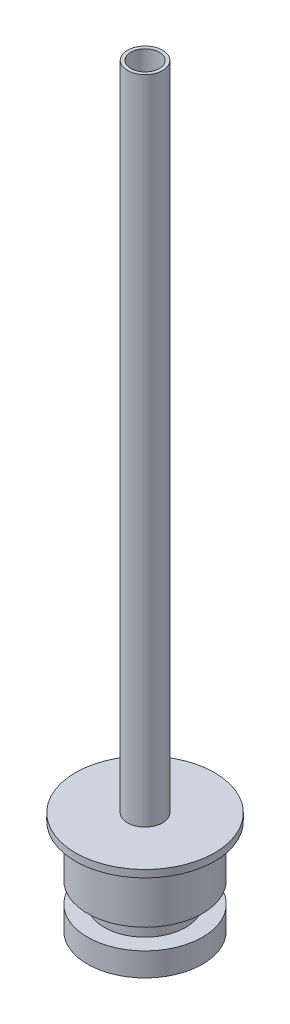
ISO-10303-21;
HEADER;
FILE_DESCRIPTION(('STEP AP214'),'2;1');
FILE_NAME('part.step','',(''),(''),'','','');
FILE_SCHEMA(('AUTOMOTIVE_DESIGN { 1 0 10303 214 1 1 1 1 }'));
ENDSEC;
DATA;
#1=APPLICATION_CONTEXT('core data for automotive mechanical design processes');
#2=APPLICATION_PROTOCOL_DEFINITION('international standard','automotive_design',2000,#1);
#3=PRODUCT_CONTEXT('',#1,'mechanical');
#4=PRODUCT('Part','Part','',(#3));
#5=PRODUCT_RELATED_PRODUCT_CATEGORY('part','',(#4));
#6=PRODUCT_DEFINITION_FORMATION('','',#4);
#7=PRODUCT_DEFINITION_CONTEXT('part definition',#1,'design');
#8=PRODUCT_DEFINITION('design','',#6,#7);
#9=PRODUCT_DEFINITION_SHAPE('','',#8);
#10=(LENGTH_UNIT() NAMED_UNIT(*) SI_UNIT(.MILLI.,.METRE.));
#11=(NAMED_UNIT(*) PLANE_ANGLE_UNIT() SI_UNIT($,.RADIAN.));
#12=(NAMED_UNIT(*) SI_UNIT($,.STERADIAN.) SOLID_ANGLE_UNIT());
#13=UNCERTAINTY_MEASURE_WITH_UNIT(LENGTH_MEASURE(1.E-05),#10,'distance_accuracy_value','');
#14=(GEOMETRIC_REPRESENTATION_CONTEXT(3) GLOBAL_UNCERTAINTY_ASSIGNED_CONTEXT((#13)) GLOBAL_UNIT_ASSIGNED_CONTEXT((#10,
#11,#12)) REPRESENTATION_CONTEXT('',''));
#15=CARTESIAN_POINT('',(0.,0.,0.));
#16=DIRECTION('',(0.,0.,1.));
#17=DIRECTION('',(1.,0.,0.));
#18=AXIS2_PLACEMENT_3D('',#15,#16,#17);
#19=CARTESIAN_POINT('',(0.,13.,0.));
#20=DIRECTION('',(0.,-1.,0.));
#21=DIRECTION('',(0.,0.,-1.));
#22=AXIS2_PLACEMENT_3D('',#19,#20,#21);
#23=CYLINDRICAL_SURFACE('',#22,7.85);
#24=CARTESIAN_POINT('',(0.,13.,0.));
#25=DIRECTION('',(0.,-1.,0.));
#26=DIRECTION('',(0.,0.,-1.));
#27=AXIS2_PLACEMENT_3D('',#24,#25,#26);
#28=CIRCLE('',#27,7.85);
#29=CARTESIAN_POINT('',(0.,13.,-7.85));
#30=VERTEX_POINT('',#29);
#31=EDGE_CURVE('E61',#30,#30,#28,.T.);
#32=CARTESIAN_POINT('',(0.,6.,0.));
#33=DIRECTION('',(0.,-1.,0.));
#34=DIRECTION('',(0.,0.,-1.));
#35=AXIS2_PLACEMENT_3D('',#32,#33,#34);
#36=CIRCLE('',#35,7.85);
#37=CARTESIAN_POINT('',(0.,6.,-7.85));
#38=VERTEX_POINT('',#37);
#39=EDGE_CURVE('E65',#38,#38,#36,.T.);
#40=CARTESIAN_POINT('',(0.,13.,-7.85));
#41=CARTESIAN_POINT('',(0.,12.9270833333333,-7.85));
#42=CARTESIAN_POINT('',(0.,12.8541666666667,-7.85));
#43=CARTESIAN_POINT('',(0.,12.7083333333333,-7.85));
#44=CARTESIAN_POINT('',(0.,12.6354166666667,-7.85));
#45=CARTESIAN_POINT('',(0.,12.4895833333333,-7.85));
#46=CARTESIAN_POINT('',(0.,12.4166666666667,-7.85));
#47=CARTESIAN_POINT('',(0.,12.2708333333333,-7.85));
#48=CARTESIAN_POINT('',(0.,12.1979166666667,-7.85));
#49=CARTESIAN_POINT('',(0.,12.0520833333333,-7.85));
#50=CARTESIAN_POINT('',(0.,11.9791666666667,-7.85));
#51=CARTESIAN_POINT('',(0.,11.8333333333333,-7.85));
#52=CARTESIAN_POINT('',(0.,11.7604166666667,-7.85));
#53=CARTESIAN_POINT('',(0.,11.6145833333333,-7.85));
#54=CARTESIAN_POINT('',(0.,11.5416666666667,-7.85));
#55=CARTESIAN_POINT('',(0.,11.3958333333333,-7.85));
#56=CARTESIAN_POINT('',(0.,11.3229166666667,-7.85));
#57=CARTESIAN_POINT('',(0.,11.1770833333333,-7.85));
#58=CARTESIAN_POINT('',(0.,11.1041666666667,-7.85));
#59=CARTESIAN_POINT('',(0.,10.9583333333333,-7.85));
#60=CARTESIAN_POINT('',(0.,10.8854166666667,-7.85));
#61=CARTESIAN_POINT('',(0.,10.7395833333333,-7.85));
#62=CARTESIAN_POINT('',(0.,10.6666666666667,-7.85));
#63=CARTESIAN_POINT('',(0.,10.5208333333333,-7.85));
#64=CARTESIAN_POINT('',(0.,10.4479166666667,-7.85));
#65=CARTESIAN_POINT('',(0.,10.3020833333333,-7.85));
#66=CARTESIAN_POINT('',(0.,10.2291666666667,-7.85));
#67=CARTESIAN_POINT('',(0.,10.0833333333333,-7.85));
#68=CARTESIAN_POINT('',(0.,10.0104166666667,-7.85));
#69=CARTESIAN_POINT('',(0.,9.86458333333333,-7.85));
#70=CARTESIAN_POINT('',(0.,9.79166666666667,-7.85));
#71=CARTESIAN_POINT('',(0.,9.64583333333333,-7.85));
#72=CARTESIAN_POINT('',(0.,9.57291666666667,-7.85));
#73=CARTESIAN_POINT('',(0.,9.42708333333333,-7.85));
#74=CARTESIAN_POINT('',(0.,9.35416666666667,-7.85));
#75=CARTESIAN_POINT('',(0.,9.20833333333333,-7.85));
#76=CARTESIAN_POINT('',(0.,9.13541666666667,-7.85));
#77=CARTESIAN_POINT('',(0.,8.98958333333333,-7.85));
#78=CARTESIAN_POINT('',(0.,8.91666666666667,-7.85));
#79=CARTESIAN_POINT('',(0.,8.77083333333333,-7.85));
#80=CARTESIAN_POINT('',(0.,8.69791666666667,-7.85));
#81=CARTESIAN_POINT('',(0.,8.55208333333333,-7.85));
#82=CARTESIAN_POINT('',(0.,8.47916666666667,-7.85));
#83=CARTESIAN_POINT('',(0.,8.33333333333333,-7.85));
#84=CARTESIAN_POINT('',(0.,8.26041666666667,-7.85));
#85=CARTESIAN_POINT('',(0.,8.11458333333333,-7.85));
#86=CARTESIAN_POINT('',(0.,8.04166666666667,-7.85));
#87=CARTESIAN_POINT('',(0.,7.89583333333333,-7.85));
#88=CARTESIAN_POINT('',(0.,7.82291666666667,-7.85));
#89=CARTESIAN_POINT('',(0.,7.67708333333333,-7.85));
#90=CARTESIAN_POINT('',(0.,7.60416666666667,-7.85));
#91=CARTESIAN_POINT('',(0.,7.45833333333333,-7.85));
#92=CARTESIAN_POINT('',(0.,7.38541666666667,-7.85));
#93=CARTESIAN_POINT('',(0.,7.23958333333333,-7.85));
#94=CARTESIAN_POINT('',(0.,7.16666666666667,-7.85));
#95=CARTESIAN_POINT('',(0.,7.02083333333333,-7.85));
#96=CARTESIAN_POINT('',(0.,6.94791666666667,-7.85));
#97=CARTESIAN_POINT('',(0.,6.80208333333333,-7.85));
#98=CARTESIAN_POINT('',(0.,6.72916666666667,-7.85));
#99=CARTESIAN_POINT('',(0.,6.58333333333333,-7.85));
#100=CARTESIAN_POINT('',(0.,6.51041666666667,-7.85));
#101=CARTESIAN_POINT('',(0.,6.36458333333333,-7.85));
#102=CARTESIAN_POINT('',(0.,6.29166666666667,-7.85));
#103=CARTESIAN_POINT('',(0.,6.14583333333333,-7.85));
#104=CARTESIAN_POINT('',(0.,6.07291666666667,-7.85));
#105=CARTESIAN_POINT('',(0.,6.,-7.85));
#106=B_SPLINE_CURVE_WITH_KNOTS('',3,(#40,#41,#42,#43,#44,#45,#46,#47,#48,#49,#50,#51,#52,#53,
#54,#55,#56,#57,#58,#59,#60,#61,#62,#63,#64,#65,#66,#67,#68,#69,#70,#71,#72,#73,#74,#75,#76,#77,
#78,#79,#80,#81,#82,#83,#84,#85,#86,#87,#88,#89,#90,#91,#92,#93,#94,#95,#96,#97,#98,#99,#100,
#101,#102,#103,#104,#105),.UNSPECIFIED.,.F.,.F.,(4,2,2,2,2,2,2,2,2,2,2,2,2,2,2,2,2,2,2,2,2,2,2,
2,2,2,2,2,2,2,2,2,4),(0.,0.218749999999998,0.437499999999999,0.656249999999999,
0.874999999999999,1.09375,1.3125,1.53125,1.75,1.96875,2.1875,2.40625,2.625,2.84375,3.0625,
3.28125,3.5,3.71875,3.9375,4.15625,4.375,4.59375,4.8125,5.03125,5.25,5.46875,5.6875,5.90625,
6.125,6.34375,6.5625,6.78125,7.),.UNSPECIFIED.);
#107=EDGE_CURVE('BSEAM33',#30,#38,#106,.T.);
#108=ORIENTED_EDGE('',*,*,#31,.T.);
#109=ORIENTED_EDGE('',*,*,#39,.F.);
#110=ORIENTED_EDGE('',*,*,#107,.T.);
#111=ORIENTED_EDGE('',*,*,#107,.F.);
#112=EDGE_LOOP('',(#108,#110,#109,#111));
#113=FACE_BOUND('',#112,.T.);
#114=ADVANCED_FACE('F33',(#113),#23,.T.);
#115=CARTESIAN_POINT('',(0.,14.,0.));
#116=DIRECTION('',(0.,-1.,0.));
#117=DIRECTION('',(0.,0.,-1.));
#118=AXIS2_PLACEMENT_3D('',#115,#116,#117);
#119=CYLINDRICAL_SURFACE('',#118,9.5);
#120=CARTESIAN_POINT('',(0.,14.,0.));
#121=DIRECTION('',(0.,1.,0.));
#122=DIRECTION('',(0.,0.,1.));
#123=AXIS2_PLACEMENT_3D('',#120,#121,#122);
#124=CIRCLE('',#123,9.5);
#125=CARTESIAN_POINT('',(0.,14.,9.5));
#126=VERTEX_POINT('',#125);
#127=EDGE_CURVE('E37',#126,#126,#124,.T.);
#128=ORIENTED_EDGE('',*,*,#127,.F.);
#129=EDGE_LOOP('',(#128));
#130=FACE_BOUND('',#129,.T.);
#131=CARTESIAN_POINT('',(0.,13.,0.));
#132=DIRECTION('',(0.,-1.,0.));
#133=DIRECTION('',(0.,0.,-1.));
#134=AXIS2_PLACEMENT_3D('',#131,#132,#133);
#135=CIRCLE('',#134,9.5);
#136=CARTESIAN_POINT('',(0.,13.,-9.5));
#137=VERTEX_POINT('',#136);
#138=EDGE_CURVE('E57',#137,#137,#135,.T.);
#139=ORIENTED_EDGE('',*,*,#138,.F.);
#140=EDGE_LOOP('',(#139));
#141=FACE_BOUND('',#140,.T.);
#142=ADVANCED_FACE('F35',(#130,#141),#119,.T.);
#143=CARTESIAN_POINT('',(0.,0.,0.));
#144=DIRECTION('',(0.,1.,0.));
#145=DIRECTION('',(0.,0.,1.));
#146=AXIS2_PLACEMENT_3D('',#143,#144,#145);
#147=PLANE('',#146);
#148=CARTESIAN_POINT('',(0.,0.,0.));
#149=DIRECTION('',(0.,1.,0.));
#150=DIRECTION('',(0.,0.,1.));
#151=AXIS2_PLACEMENT_3D('',#148,#149,#150);
#152=CIRCLE('',#151,1.94);
#153=CARTESIAN_POINT('',(0.,0.,1.94));
#154=VERTEX_POINT('',#153);
#155=EDGE_CURVE('E50',#154,#154,#152,.T.);
#156=ORIENTED_EDGE('',*,*,#155,.T.);
#157=EDGE_LOOP('',(#156));
#158=FACE_BOUND('',#157,.T.);
#159=CARTESIAN_POINT('',(0.,0.,0.));
#160=DIRECTION('',(0.,-1.,0.));
#161=DIRECTION('',(0.,0.,-1.));
#162=AXIS2_PLACEMENT_3D('',#159,#160,#161);
#163=CIRCLE('',#162,7.85);
#164=CARTESIAN_POINT('',(0.,0.,-7.85));
#165=VERTEX_POINT('',#164);
#166=EDGE_CURVE('E62',#165,#165,#163,.T.);
#167=ORIENTED_EDGE('',*,*,#166,.T.);
#168=EDGE_LOOP('',(#167));
#169=FACE_BOUND('',#168,.T.);
#170=ADVANCED_FACE('F97',(#158,#169),#147,.F.);
#171=CARTESIAN_POINT('',(0.,14.,0.));
#172=DIRECTION('',(0.,1.,0.));
#173=DIRECTION('',(0.,0.,1.));
#174=AXIS2_PLACEMENT_3D('',#171,#172,#173);
#175=PLANE('',#174);
#176=CARTESIAN_POINT('',(0.,14.,0.));
#177=DIRECTION('',(0.,1.,0.));
#178=DIRECTION('',(0.,0.,1.));
#179=AXIS2_PLACEMENT_3D('',#176,#177,#178);
#180=CIRCLE('',#179,2.4);
#181=CARTESIAN_POINT('',(0.,14.,2.4));
#182=VERTEX_POINT('',#181);
#183=EDGE_CURVE('E11',#182,#182,#180,.T.);
#184=ORIENTED_EDGE('',*,*,#183,.F.);
#185=EDGE_LOOP('',(#184));
#186=FACE_BOUND('',#185,.T.);
#187=ORIENTED_EDGE('',*,*,#127,.T.);
#188=EDGE_LOOP('',(#187));
#189=FACE_BOUND('',#188,.T.);
#190=ADVANCED_FACE('F114',(#186,#189),#175,.T.);
#191=CARTESIAN_POINT('',(0.,212.788225099391,0.));
#192=DIRECTION('',(0.,-1.,0.));
#193=DIRECTION('',(0.,0.,-1.));
#194=AXIS2_PLACEMENT_3D('',#191,#192,#193);
#195=CYLINDRICAL_SURFACE('',#194,2.4);
#196=ORIENTED_EDGE('',*,*,#183,.T.);
#197=EDGE_LOOP('',(#196));
#198=FACE_BOUND('',#197,.T.);
#199=CARTESIAN_POINT('',(0.,103.,0.));
#200=DIRECTION('',(0.,1.,0.));
#201=DIRECTION('',(0.,0.,1.));
#202=AXIS2_PLACEMENT_3D('',#199,#200,#201);
#203=CIRCLE('',#202,2.4);
#204=CARTESIAN_POINT('',(0.,103.,2.4));
#205=VERTEX_POINT('',#204);
#206=EDGE_CURVE('E45',#205,#205,#203,.T.);
#207=ORIENTED_EDGE('',*,*,#206,.F.);
#208=EDGE_LOOP('',(#207));
#209=FACE_BOUND('',#208,.T.);
#210=ADVANCED_FACE('F118',(#198,#209),#195,.T.);
#211=CARTESIAN_POINT('',(0.,103.,0.));
#212=DIRECTION('',(0.,1.,0.));
#213=DIRECTION('',(0.,0.,1.));
#214=AXIS2_PLACEMENT_3D('',#211,#212,#213);
#215=PLANE('',#214);
#216=CARTESIAN_POINT('',(0.,103.,0.));
#217=DIRECTION('',(0.,1.,0.));
#218=DIRECTION('',(0.,0.,1.));
#219=AXIS2_PLACEMENT_3D('',#216,#217,#218);
#220=CIRCLE('',#219,1.94);
#221=CARTESIAN_POINT('',(0.,103.,1.94));
#222=VERTEX_POINT('',#221);
#223=EDGE_CURVE('E47',#222,#222,#220,.T.);
#224=ORIENTED_EDGE('',*,*,#223,.F.);
#225=EDGE_LOOP('',(#224));
#226=FACE_BOUND('',#225,.T.);
#227=ORIENTED_EDGE('',*,*,#206,.T.);
#228=EDGE_LOOP('',(#227));
#229=FACE_BOUND('',#228,.T.);
#230=ADVANCED_FACE('F122',(#226,#229),#215,.T.);
#231=CARTESIAN_POINT('',(0.,0.,0.));
#232=DIRECTION('',(0.,1.,0.));
#233=DIRECTION('',(0.,0.,1.));
#234=AXIS2_PLACEMENT_3D('',#231,#232,#233);
#235=CYLINDRICAL_SURFACE('',#234,1.94);
#236=ORIENTED_EDGE('',*,*,#155,.F.);
#237=EDGE_LOOP('',(#236));
#238=FACE_BOUND('',#237,.T.);
#239=ORIENTED_EDGE('',*,*,#223,.T.);
#240=EDGE_LOOP('',(#239));
#241=FACE_BOUND('',#240,.T.);
#242=ADVANCED_FACE('F107',(#238,#241),#235,.F.);
#243=CARTESIAN_POINT('',(0.,13.,0.));
#244=DIRECTION('',(0.,-1.,0.));
#245=DIRECTION('',(0.,0.,-1.));
#246=AXIS2_PLACEMENT_3D('',#243,#244,#245);
#247=PLANE('',#246);
#248=ORIENTED_EDGE('',*,*,#31,.F.);
#249=EDGE_LOOP('',(#248));
#250=FACE_BOUND('',#249,.T.);
#251=ORIENTED_EDGE('',*,*,#138,.T.);
#252=EDGE_LOOP('',(#251));
#253=FACE_BOUND('',#252,.T.);
#254=ADVANCED_FACE('F102',(#250,#253),#247,.T.);
#255=CARTESIAN_POINT('',(0.,3.2,0.));
#256=DIRECTION('',(0.,-1.,0.));
#257=DIRECTION('',(0.,0.,-1.));
#258=AXIS2_PLACEMENT_3D('',#255,#256,#257);
#259=CIRCLE('',#258,7.85);
#260=CARTESIAN_POINT('',(0.,3.2,-7.85));
#261=VERTEX_POINT('',#260);
#262=EDGE_CURVE('E68',#261,#261,#259,.T.);
#263=CARTESIAN_POINT('',(0.,3.2,-7.85));
#264=CARTESIAN_POINT('',(0.,3.16666666666667,-7.85));
#265=CARTESIAN_POINT('',(0.,3.13333333333334,-7.85));
#266=CARTESIAN_POINT('',(0.,3.06666666666667,-7.85));
#267=CARTESIAN_POINT('',(0.,3.03333333333333,-7.85));
#268=CARTESIAN_POINT('',(0.,2.96666666666667,-7.85));
#269=CARTESIAN_POINT('',(0.,2.93333333333333,-7.85));
#270=CARTESIAN_POINT('',(0.,2.86666666666667,-7.85));
#271=CARTESIAN_POINT('',(0.,2.83333333333333,-7.85));
#272=CARTESIAN_POINT('',(0.,2.76666666666667,-7.85));
#273=CARTESIAN_POINT('',(0.,2.73333333333333,-7.85));
#274=CARTESIAN_POINT('',(0.,2.66666666666667,-7.85));
#275=CARTESIAN_POINT('',(0.,2.63333333333333,-7.85));
#276=CARTESIAN_POINT('',(0.,2.56666666666667,-7.85));
#277=CARTESIAN_POINT('',(0.,2.53333333333333,-7.85));
#278=CARTESIAN_POINT('',(0.,2.46666666666667,-7.85));
#279=CARTESIAN_POINT('',(0.,2.43333333333333,-7.85));
#280=CARTESIAN_POINT('',(0.,2.36666666666667,-7.85));
#281=CARTESIAN_POINT('',(0.,2.33333333333333,-7.85));
#282=CARTESIAN_POINT('',(0.,2.26666666666667,-7.85));
#283=CARTESIAN_POINT('',(0.,2.23333333333333,-7.85));
#284=CARTESIAN_POINT('',(0.,2.16666666666667,-7.85));
#285=CARTESIAN_POINT('',(0.,2.13333333333333,-7.85));
#286=CARTESIAN_POINT('',(0.,2.06666666666667,-7.85));
#287=CARTESIAN_POINT('',(0.,2.03333333333333,-7.85));
#288=CARTESIAN_POINT('',(0.,1.96666666666667,-7.85));
#289=CARTESIAN_POINT('',(0.,1.93333333333333,-7.85));
#290=CARTESIAN_POINT('',(0.,1.86666666666667,-7.85));
#291=CARTESIAN_POINT('',(0.,1.83333333333333,-7.85));
#292=CARTESIAN_POINT('',(0.,1.76666666666667,-7.85));
#293=CARTESIAN_POINT('',(0.,1.73333333333333,-7.85));
#294=CARTESIAN_POINT('',(0.,1.66666666666667,-7.85));
#295=CARTESIAN_POINT('',(0.,1.63333333333333,-7.85));
#296=CARTESIAN_POINT('',(0.,1.56666666666667,-7.85));
#297=CARTESIAN_POINT('',(0.,1.53333333333333,-7.85));
#298=CARTESIAN_POINT('',(0.,1.46666666666667,-7.85));
#299=CARTESIAN_POINT('',(0.,1.43333333333333,-7.85));
#300=CARTESIAN_POINT('',(0.,1.36666666666667,-7.85));
#301=CARTESIAN_POINT('',(0.,1.33333333333333,-7.85));
#302=CARTESIAN_POINT('',(0.,1.26666666666667,-7.85));
#303=CARTESIAN_POINT('',(0.,1.23333333333333,-7.85));
#304=CARTESIAN_POINT('',(0.,1.16666666666667,-7.85));
#305=CARTESIAN_POINT('',(0.,1.13333333333333,-7.85));
#306=CARTESIAN_POINT('',(0.,1.06666666666667,-7.85));
#307=CARTESIAN_POINT('',(0.,1.03333333333333,-7.85));
#308=CARTESIAN_POINT('',(0.,0.966666666666668,-7.85));
#309=CARTESIAN_POINT('',(0.,0.933333333333335,-7.85));
#310=CARTESIAN_POINT('',(0.,0.866666666666668,-7.85));
#311=CARTESIAN_POINT('',(0.,0.833333333333334,-7.85));
#312=CARTESIAN_POINT('',(0.,0.766666666666667,-7.85));
#313=CARTESIAN_POINT('',(0.,0.733333333333333,-7.85));
#314=CARTESIAN_POINT('',(0.,0.666666666666666,-7.85));
#315=CARTESIAN_POINT('',(0.,0.633333333333333,-7.85));
#316=CARTESIAN_POINT('',(0.,0.566666666666667,-7.85));
#317=CARTESIAN_POINT('',(0.,0.533333333333334,-7.85));
#318=CARTESIAN_POINT('',(0.,0.466666666666667,-7.85));
#319=CARTESIAN_POINT('',(0.,0.433333333333334,-7.85));
#320=CARTESIAN_POINT('',(0.,0.366666666666667,-7.85));
#321=CARTESIAN_POINT('',(0.,0.333333333333334,-7.85));
#322=CARTESIAN_POINT('',(0.,0.266666666666667,-7.85));
#323=CARTESIAN_POINT('',(0.,0.233333333333334,-7.85));
#324=CARTESIAN_POINT('',(0.,0.166666666666667,-7.85));
#325=CARTESIAN_POINT('',(0.,0.133333333333333,-7.85));
#326=CARTESIAN_POINT('',(0.,0.0666666666666662,-7.85));
#327=CARTESIAN_POINT('',(0.,0.0333333333333331,-7.85));
#328=CARTESIAN_POINT('',(0.,0.,-7.85));
#329=B_SPLINE_CURVE_WITH_KNOTS('',3,(#263,#264,#265,#266,#267,#268,#269,#270,#271,#272,#273,
#274,#275,#276,#277,#278,#279,#280,#281,#282,#283,#284,#285,#286,#287,#288,#289,#290,#291,#292,
#293,#294,#295,#296,#297,#298,#299,#300,#301,#302,#303,#304,#305,#306,#307,#308,#309,#310,#311,
#312,#313,#314,#315,#316,#317,#318,#319,#320,#321,#322,#323,#324,#325,#326,#327,#328),
.UNSPECIFIED.,.F.,.F.,(4,2,2,2,2,2,2,2,2,2,2,2,2,2,2,2,2,2,2,2,2,2,2,2,2,2,2,2,2,2,2,2,4),(0.,
0.0999999999999994,0.200000000000001,0.3,0.400000000000001,0.5,0.6,0.700000000000001,0.8,0.9,1.,
1.1,1.2,1.3,1.4,1.5,1.6,1.7,1.8,1.9,2.,2.1,2.2,2.3,2.4,2.5,2.6,2.7,2.8,2.9,3.,3.1,3.2),.UNSPECIFIED.);
#330=EDGE_CURVE('BSEAM87',#261,#165,#329,.T.);
#331=ORIENTED_EDGE('',*,*,#262,.T.);
#332=ORIENTED_EDGE('',*,*,#166,.F.);
#333=ORIENTED_EDGE('',*,*,#330,.T.);
#334=ORIENTED_EDGE('',*,*,#330,.F.);
#335=EDGE_LOOP('',(#331,#333,#332,#334));
#336=FACE_BOUND('',#335,.T.);
#337=ADVANCED_FACE('F87',(#336),#23,.T.);
#338=CARTESIAN_POINT('',(0.,6.,0.));
#339=DIRECTION('',(0.,-1.,0.));
#340=DIRECTION('',(0.,0.,-1.));
#341=AXIS2_PLACEMENT_3D('',#338,#339,#340);
#342=PLANE('',#341);
#343=CARTESIAN_POINT('',(0.,6.,0.));
#344=DIRECTION('',(0.,-1.,0.));
#345=DIRECTION('',(0.,0.,-1.));
#346=AXIS2_PLACEMENT_3D('',#343,#344,#345);
#347=CIRCLE('',#346,5.55);
#348=CARTESIAN_POINT('',(0.,6.,-5.55));
#349=VERTEX_POINT('',#348);
#350=EDGE_CURVE('E71',#349,#349,#347,.T.);
#351=ORIENTED_EDGE('',*,*,#350,.F.);
#352=EDGE_LOOP('',(#351));
#353=FACE_BOUND('',#352,.T.);
#354=ORIENTED_EDGE('',*,*,#39,.T.);
#355=EDGE_LOOP('',(#354));
#356=FACE_BOUND('',#355,.T.);
#357=ADVANCED_FACE('F83',(#353,#356),#342,.T.);
#358=CARTESIAN_POINT('',(0.,3.2,0.));
#359=DIRECTION('',(0.,-1.,0.));
#360=DIRECTION('',(0.,0.,-1.));
#361=AXIS2_PLACEMENT_3D('',#358,#359,#360);
#362=PLANE('',#361);
#363=CARTESIAN_POINT('',(0.,3.2,0.));
#364=DIRECTION('',(0.,-1.,0.));
#365=DIRECTION('',(0.,0.,-1.));
#366=AXIS2_PLACEMENT_3D('',#363,#364,#365);
#367=CIRCLE('',#366,5.55);
#368=CARTESIAN_POINT('',(0.,3.2,-5.55));
#369=VERTEX_POINT('',#368);
#370=EDGE_CURVE('E74',#369,#369,#367,.T.);
#371=ORIENTED_EDGE('',*,*,#370,.T.);
#372=EDGE_LOOP('',(#371));
#373=FACE_BOUND('',#372,.T.);
#374=ORIENTED_EDGE('',*,*,#262,.F.);
#375=EDGE_LOOP('',(#374));
#376=FACE_BOUND('',#375,.T.);
#377=ADVANCED_FACE('F86',(#373,#376),#362,.F.);
#378=CARTESIAN_POINT('',(0.,6.,0.));
#379=DIRECTION('',(0.,-1.,0.));
#380=DIRECTION('',(0.,0.,-1.));
#381=AXIS2_PLACEMENT_3D('',#378,#379,#380);
#382=CYLINDRICAL_SURFACE('',#381,5.55);
#383=ORIENTED_EDGE('',*,*,#350,.T.);
#384=EDGE_LOOP('',(#383));
#385=FACE_BOUND('',#384,.T.);
#386=ORIENTED_EDGE('',*,*,#370,.F.);
#387=EDGE_LOOP('',(#386));
#388=FACE_BOUND('',#387,.T.);
#389=ADVANCED_FACE('F80',(#385,#388),#382,.T.);
#390=CLOSED_SHELL('',(#114,#142,#170,#190,#210,#230,#242,#254,#337,#357,#377,#389));
#391=MANIFOLD_SOLID_BREP('B2',#390);
#392=ADVANCED_BREP_SHAPE_REPRESENTATION('',(#18,#391),#14);
#393=SHAPE_DEFINITION_REPRESENTATION(#9,#392);
ENDSEC;
END-ISO-10303-21;
